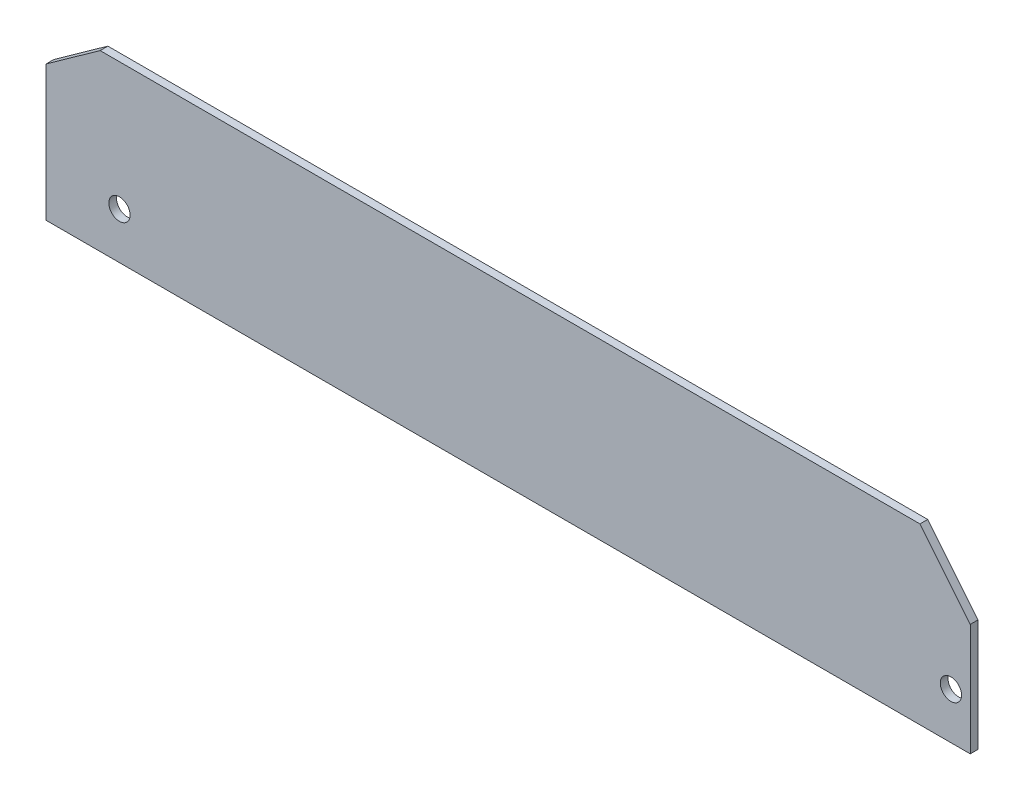
ISO-10303-21;
HEADER;
FILE_DESCRIPTION(('STEP AP214'),'2;1');
FILE_NAME('part.step','',(''),(''),'','','');
FILE_SCHEMA(('AUTOMOTIVE_DESIGN { 1 0 10303 214 1 1 1 1 }'));
ENDSEC;
DATA;
#1=APPLICATION_CONTEXT('core data for automotive mechanical design processes');
#2=APPLICATION_PROTOCOL_DEFINITION('international standard','automotive_design',2000,#1);
#3=PRODUCT_CONTEXT('',#1,'mechanical');
#4=PRODUCT('Part','Part','',(#3));
#5=PRODUCT_RELATED_PRODUCT_CATEGORY('part','',(#4));
#6=PRODUCT_DEFINITION_FORMATION('','',#4);
#7=PRODUCT_DEFINITION_CONTEXT('part definition',#1,'design');
#8=PRODUCT_DEFINITION('design','',#6,#7);
#9=PRODUCT_DEFINITION_SHAPE('','',#8);
#10=(LENGTH_UNIT() NAMED_UNIT(*) SI_UNIT(.MILLI.,.METRE.));
#11=(NAMED_UNIT(*) PLANE_ANGLE_UNIT() SI_UNIT($,.RADIAN.));
#12=(NAMED_UNIT(*) SI_UNIT($,.STERADIAN.) SOLID_ANGLE_UNIT());
#13=UNCERTAINTY_MEASURE_WITH_UNIT(LENGTH_MEASURE(1.E-05),#10,'distance_accuracy_value','');
#14=(GEOMETRIC_REPRESENTATION_CONTEXT(3) GLOBAL_UNCERTAINTY_ASSIGNED_CONTEXT((#13)) GLOBAL_UNIT_ASSIGNED_CONTEXT((#10,
#11,#12)) REPRESENTATION_CONTEXT('',''));
#15=CARTESIAN_POINT('',(0.,0.,0.));
#16=DIRECTION('',(0.,0.,1.));
#17=DIRECTION('',(1.,0.,0.));
#18=AXIS2_PLACEMENT_3D('',#15,#16,#17);
#19=CARTESIAN_POINT('',(0.,0.,2.));
#20=DIRECTION('',(0.,0.,1.));
#21=DIRECTION('',(1.,0.,0.));
#22=AXIS2_PLACEMENT_3D('',#19,#20,#21);
#23=PLANE('',#22);
#24=CARTESIAN_POINT('',(-117.,19.,2.));
#25=DIRECTION('',(0.,0.,1.));
#26=DIRECTION('',(1.,0.,0.));
#27=AXIS2_PLACEMENT_3D('',#24,#25,#26);
#28=CIRCLE('',#27,2.75);
#29=CARTESIAN_POINT('',(-114.25,19.,2.));
#30=VERTEX_POINT('',#29);
#31=EDGE_CURVE('E141',#30,#30,#28,.T.);
#32=ORIENTED_EDGE('',*,*,#31,.F.);
#33=EDGE_LOOP('',(#32));
#34=FACE_BOUND('',#33,.T.);
#35=DIRECTION('',(0.,-1.,0.));
#36=VECTOR('',#35,1.);
#37=CARTESIAN_POINT('',(-136.,42.,2.));
#38=LINE('',#37,#36);
#39=CARTESIAN_POINT('',(-136.,42.,2.));
#40=VERTEX_POINT('',#39);
#41=CARTESIAN_POINT('',(-136.,7.,2.));
#42=VERTEX_POINT('',#41);
#43=EDGE_CURVE('E153',#40,#42,#38,.T.);
#44=ORIENTED_EDGE('',*,*,#43,.T.);
#45=DIRECTION('',(1.,0.,0.));
#46=VECTOR('',#45,1.);
#47=CARTESIAN_POINT('',(-136.,7.,2.));
#48=LINE('',#47,#46);
#49=CARTESIAN_POINT('',(103.,7.,2.));
#50=VERTEX_POINT('',#49);
#51=EDGE_CURVE('E100',#42,#50,#48,.T.);
#52=ORIENTED_EDGE('',*,*,#51,.T.);
#53=DIRECTION('',(0.,1.,0.));
#54=VECTOR('',#53,1.);
#55=CARTESIAN_POINT('',(103.,7.,2.));
#56=LINE('',#55,#54);
#57=CARTESIAN_POINT('',(103.,36.,2.));
#58=VERTEX_POINT('',#57);
#59=EDGE_CURVE('E113',#50,#58,#56,.T.);
#60=ORIENTED_EDGE('',*,*,#59,.T.);
#61=DIRECTION('',(-0.630592625094466,0.776114000116266,0.));
#62=VECTOR('',#61,1.);
#63=CARTESIAN_POINT('',(103.,36.,2.));
#64=LINE('',#63,#62);
#65=CARTESIAN_POINT('',(90.,52.,2.));
#66=VERTEX_POINT('',#65);
#67=EDGE_CURVE('E107',#58,#66,#64,.T.);
#68=ORIENTED_EDGE('',*,*,#67,.T.);
#69=DIRECTION('',(-1.,0.,0.));
#70=VECTOR('',#69,1.);
#71=CARTESIAN_POINT('',(90.,52.,2.));
#72=LINE('',#71,#70);
#73=CARTESIAN_POINT('',(-122.,52.,2.));
#74=VERTEX_POINT('',#73);
#75=EDGE_CURVE('E111',#66,#74,#72,.T.);
#76=ORIENTED_EDGE('',*,*,#75,.T.);
#77=DIRECTION('',(-0.813733471206735,-0.581238193719096,0.));
#78=VECTOR('',#77,1.);
#79=CARTESIAN_POINT('',(-122.,52.,2.));
#80=LINE('',#79,#78);
#81=EDGE_CURVE('E63',#74,#40,#80,.T.);
#82=ORIENTED_EDGE('',*,*,#81,.T.);
#83=EDGE_LOOP('',(#44,#52,#60,#68,#76,#82));
#84=FACE_BOUND('',#83,.T.);
#85=CARTESIAN_POINT('',(98.,19.,2.));
#86=DIRECTION('',(0.,0.,1.));
#87=DIRECTION('',(1.,0.,0.));
#88=AXIS2_PLACEMENT_3D('',#85,#86,#87);
#89=CIRCLE('',#88,2.75);
#90=CARTESIAN_POINT('',(100.75,19.,2.));
#91=VERTEX_POINT('',#90);
#92=EDGE_CURVE('E196',#91,#91,#89,.T.);
#93=ORIENTED_EDGE('',*,*,#92,.F.);
#94=EDGE_LOOP('',(#93));
#95=FACE_BOUND('',#94,.T.);
#96=ADVANCED_FACE('F45',(#34,#84,#95),#23,.T.);
#97=CARTESIAN_POINT('',(0.,0.,0.));
#98=DIRECTION('',(0.,0.,1.));
#99=DIRECTION('',(1.,0.,0.));
#100=AXIS2_PLACEMENT_3D('',#97,#98,#99);
#101=PLANE('',#100);
#102=DIRECTION('',(0.,-1.,0.));
#103=VECTOR('',#102,1.);
#104=CARTESIAN_POINT('',(-136.,42.,0.));
#105=LINE('',#104,#103);
#106=CARTESIAN_POINT('',(-136.,42.,0.));
#107=VERTEX_POINT('',#106);
#108=CARTESIAN_POINT('',(-136.,7.,0.));
#109=VERTEX_POINT('',#108);
#110=EDGE_CURVE('E136',#107,#109,#105,.T.);
#111=ORIENTED_EDGE('',*,*,#110,.F.);
#112=DIRECTION('',(-0.813733471206735,-0.581238193719096,0.));
#113=VECTOR('',#112,1.);
#114=CARTESIAN_POINT('',(-122.,52.,0.));
#115=LINE('',#114,#113);
#116=CARTESIAN_POINT('',(-122.,52.,0.));
#117=VERTEX_POINT('',#116);
#118=EDGE_CURVE('E92',#117,#107,#115,.T.);
#119=ORIENTED_EDGE('',*,*,#118,.F.);
#120=DIRECTION('',(-1.,0.,0.));
#121=VECTOR('',#120,1.);
#122=CARTESIAN_POINT('',(90.,52.,0.));
#123=LINE('',#122,#121);
#124=CARTESIAN_POINT('',(90.,52.,0.));
#125=VERTEX_POINT('',#124);
#126=EDGE_CURVE('E86',#125,#117,#123,.T.);
#127=ORIENTED_EDGE('',*,*,#126,.F.);
#128=DIRECTION('',(-0.630592625094466,0.776114000116266,0.));
#129=VECTOR('',#128,1.);
#130=CARTESIAN_POINT('',(103.,36.,0.));
#131=LINE('',#130,#129);
#132=CARTESIAN_POINT('',(103.,36.,0.));
#133=VERTEX_POINT('',#132);
#134=EDGE_CURVE('E122',#133,#125,#131,.T.);
#135=ORIENTED_EDGE('',*,*,#134,.F.);
#136=DIRECTION('',(0.,1.,0.));
#137=VECTOR('',#136,1.);
#138=CARTESIAN_POINT('',(103.,7.,0.));
#139=LINE('',#138,#137);
#140=CARTESIAN_POINT('',(103.,7.,0.));
#141=VERTEX_POINT('',#140);
#142=EDGE_CURVE('E144',#141,#133,#139,.T.);
#143=ORIENTED_EDGE('',*,*,#142,.F.);
#144=DIRECTION('',(1.,0.,0.));
#145=VECTOR('',#144,1.);
#146=CARTESIAN_POINT('',(-136.,7.,0.));
#147=LINE('',#146,#145);
#148=EDGE_CURVE('E140',#109,#141,#147,.T.);
#149=ORIENTED_EDGE('',*,*,#148,.F.);
#150=EDGE_LOOP('',(#111,#119,#127,#135,#143,#149));
#151=FACE_BOUND('',#150,.T.);
#152=CARTESIAN_POINT('',(-117.,19.,0.));
#153=DIRECTION('',(0.,0.,1.));
#154=DIRECTION('',(1.,0.,0.));
#155=AXIS2_PLACEMENT_3D('',#152,#153,#154);
#156=CIRCLE('',#155,2.75);
#157=CARTESIAN_POINT('',(-114.25,19.,0.));
#158=VERTEX_POINT('',#157);
#159=EDGE_CURVE('E203',#158,#158,#156,.T.);
#160=ORIENTED_EDGE('',*,*,#159,.T.);
#161=EDGE_LOOP('',(#160));
#162=FACE_BOUND('',#161,.T.);
#163=CARTESIAN_POINT('',(98.,19.,0.));
#164=DIRECTION('',(0.,0.,1.));
#165=DIRECTION('',(1.,0.,0.));
#166=AXIS2_PLACEMENT_3D('',#163,#164,#165);
#167=CIRCLE('',#166,2.75);
#168=CARTESIAN_POINT('',(100.75,19.,0.));
#169=VERTEX_POINT('',#168);
#170=EDGE_CURVE('E199',#169,#169,#167,.T.);
#171=ORIENTED_EDGE('',*,*,#170,.T.);
#172=EDGE_LOOP('',(#171));
#173=FACE_BOUND('',#172,.T.);
#174=ADVANCED_FACE('F166',(#151,#162,#173),#101,.F.);
#175=CARTESIAN_POINT('',(-136.,42.,2.));
#176=DIRECTION('',(1.,0.,0.));
#177=DIRECTION('',(0.,0.,-1.));
#178=AXIS2_PLACEMENT_3D('',#175,#176,#177);
#179=PLANE('',#178);
#180=ORIENTED_EDGE('',*,*,#110,.T.);
#181=DIRECTION('',(0.,0.,-1.));
#182=VECTOR('',#181,1.);
#183=CARTESIAN_POINT('',(-136.,7.,2.));
#184=LINE('',#183,#182);
#185=EDGE_CURVE('E11',#42,#109,#184,.T.);
#186=ORIENTED_EDGE('',*,*,#185,.F.);
#187=ORIENTED_EDGE('',*,*,#43,.F.);
#188=DIRECTION('',(0.,0.,-1.));
#189=VECTOR('',#188,1.);
#190=CARTESIAN_POINT('',(-136.,42.,2.));
#191=LINE('',#190,#189);
#192=EDGE_CURVE('E132',#40,#107,#191,.T.);
#193=ORIENTED_EDGE('',*,*,#192,.T.);
#194=EDGE_LOOP('',(#180,#186,#187,#193));
#195=FACE_BOUND('',#194,.T.);
#196=ADVANCED_FACE('F47',(#195),#179,.F.);
#197=CARTESIAN_POINT('',(-136.,7.,2.));
#198=DIRECTION('',(0.,1.,0.));
#199=DIRECTION('',(0.,0.,1.));
#200=AXIS2_PLACEMENT_3D('',#197,#198,#199);
#201=PLANE('',#200);
#202=ORIENTED_EDGE('',*,*,#148,.T.);
#203=DIRECTION('',(0.,0.,-1.));
#204=VECTOR('',#203,1.);
#205=CARTESIAN_POINT('',(103.,7.,2.));
#206=LINE('',#205,#204);
#207=EDGE_CURVE('E55',#50,#141,#206,.T.);
#208=ORIENTED_EDGE('',*,*,#207,.F.);
#209=ORIENTED_EDGE('',*,*,#51,.F.);
#210=ORIENTED_EDGE('',*,*,#185,.T.);
#211=EDGE_LOOP('',(#202,#208,#209,#210));
#212=FACE_BOUND('',#211,.T.);
#213=ADVANCED_FACE('F250',(#212),#201,.F.);
#214=CARTESIAN_POINT('',(103.,7.,2.));
#215=DIRECTION('',(-1.,0.,0.));
#216=DIRECTION('',(0.,0.,1.));
#217=AXIS2_PLACEMENT_3D('',#214,#215,#216);
#218=PLANE('',#217);
#219=ORIENTED_EDGE('',*,*,#142,.T.);
#220=DIRECTION('',(0.,0.,-1.));
#221=VECTOR('',#220,1.);
#222=CARTESIAN_POINT('',(103.,36.,2.));
#223=LINE('',#222,#221);
#224=EDGE_CURVE('E124',#58,#133,#223,.T.);
#225=ORIENTED_EDGE('',*,*,#224,.F.);
#226=ORIENTED_EDGE('',*,*,#59,.F.);
#227=ORIENTED_EDGE('',*,*,#207,.T.);
#228=EDGE_LOOP('',(#219,#225,#226,#227));
#229=FACE_BOUND('',#228,.T.);
#230=ADVANCED_FACE('F163',(#229),#218,.F.);
#231=CARTESIAN_POINT('',(103.,36.,2.));
#232=DIRECTION('',(-0.776114000116266,-0.630592625094466,0.));
#233=DIRECTION('',(0.630592625094466,-0.776114000116266,0.));
#234=AXIS2_PLACEMENT_3D('',#231,#232,#233);
#235=PLANE('',#234);
#236=ORIENTED_EDGE('',*,*,#134,.T.);
#237=DIRECTION('',(0.,0.,-1.));
#238=VECTOR('',#237,1.);
#239=CARTESIAN_POINT('',(90.,52.,2.));
#240=LINE('',#239,#238);
#241=EDGE_CURVE('E119',#66,#125,#240,.T.);
#242=ORIENTED_EDGE('',*,*,#241,.F.);
#243=ORIENTED_EDGE('',*,*,#67,.F.);
#244=ORIENTED_EDGE('',*,*,#224,.T.);
#245=EDGE_LOOP('',(#236,#242,#243,#244));
#246=FACE_BOUND('',#245,.T.);
#247=ADVANCED_FACE('F120',(#246),#235,.F.);
#248=CARTESIAN_POINT('',(90.,52.,2.));
#249=DIRECTION('',(0.,-1.,0.));
#250=DIRECTION('',(0.,0.,-1.));
#251=AXIS2_PLACEMENT_3D('',#248,#249,#250);
#252=PLANE('',#251);
#253=ORIENTED_EDGE('',*,*,#126,.T.);
#254=DIRECTION('',(0.,0.,-1.));
#255=VECTOR('',#254,1.);
#256=CARTESIAN_POINT('',(-122.,52.,2.));
#257=LINE('',#256,#255);
#258=EDGE_CURVE('E125',#74,#117,#257,.T.);
#259=ORIENTED_EDGE('',*,*,#258,.F.);
#260=ORIENTED_EDGE('',*,*,#75,.F.);
#261=ORIENTED_EDGE('',*,*,#241,.T.);
#262=EDGE_LOOP('',(#253,#259,#260,#261));
#263=FACE_BOUND('',#262,.T.);
#264=ADVANCED_FACE('F127',(#263),#252,.F.);
#265=CARTESIAN_POINT('',(-122.,52.,2.));
#266=DIRECTION('',(0.581238193719096,-0.813733471206735,0.));
#267=DIRECTION('',(0.813733471206735,0.581238193719096,0.));
#268=AXIS2_PLACEMENT_3D('',#265,#266,#267);
#269=PLANE('',#268);
#270=ORIENTED_EDGE('',*,*,#118,.T.);
#271=ORIENTED_EDGE('',*,*,#192,.F.);
#272=ORIENTED_EDGE('',*,*,#81,.F.);
#273=ORIENTED_EDGE('',*,*,#258,.T.);
#274=EDGE_LOOP('',(#270,#271,#272,#273));
#275=FACE_BOUND('',#274,.T.);
#276=ADVANCED_FACE('F171',(#275),#269,.F.);
#277=CARTESIAN_POINT('',(-117.,19.,2.));
#278=DIRECTION('',(0.,0.,-1.));
#279=DIRECTION('',(-1.,0.,0.));
#280=AXIS2_PLACEMENT_3D('',#277,#278,#279);
#281=CYLINDRICAL_SURFACE('',#280,2.75);
#282=ORIENTED_EDGE('',*,*,#31,.T.);
#283=EDGE_LOOP('',(#282));
#284=FACE_BOUND('',#283,.T.);
#285=ORIENTED_EDGE('',*,*,#159,.F.);
#286=EDGE_LOOP('',(#285));
#287=FACE_BOUND('',#286,.T.);
#288=ADVANCED_FACE('F173',(#284,#287),#281,.F.);
#289=CARTESIAN_POINT('',(98.,19.,2.));
#290=DIRECTION('',(0.,0.,-1.));
#291=DIRECTION('',(-1.,0.,0.));
#292=AXIS2_PLACEMENT_3D('',#289,#290,#291);
#293=CYLINDRICAL_SURFACE('',#292,2.75);
#294=ORIENTED_EDGE('',*,*,#92,.T.);
#295=EDGE_LOOP('',(#294));
#296=FACE_BOUND('',#295,.T.);
#297=ORIENTED_EDGE('',*,*,#170,.F.);
#298=EDGE_LOOP('',(#297));
#299=FACE_BOUND('',#298,.T.);
#300=ADVANCED_FACE('F178',(#296,#299),#293,.F.);
#301=CLOSED_SHELL('',(#96,#174,#196,#213,#230,#247,#264,#276,#288,#300));
#302=MANIFOLD_SOLID_BREP('B2',#301);
#303=ADVANCED_BREP_SHAPE_REPRESENTATION('',(#18,#302),#14);
#304=SHAPE_DEFINITION_REPRESENTATION(#9,#303);
ENDSEC;
END-ISO-10303-21;
